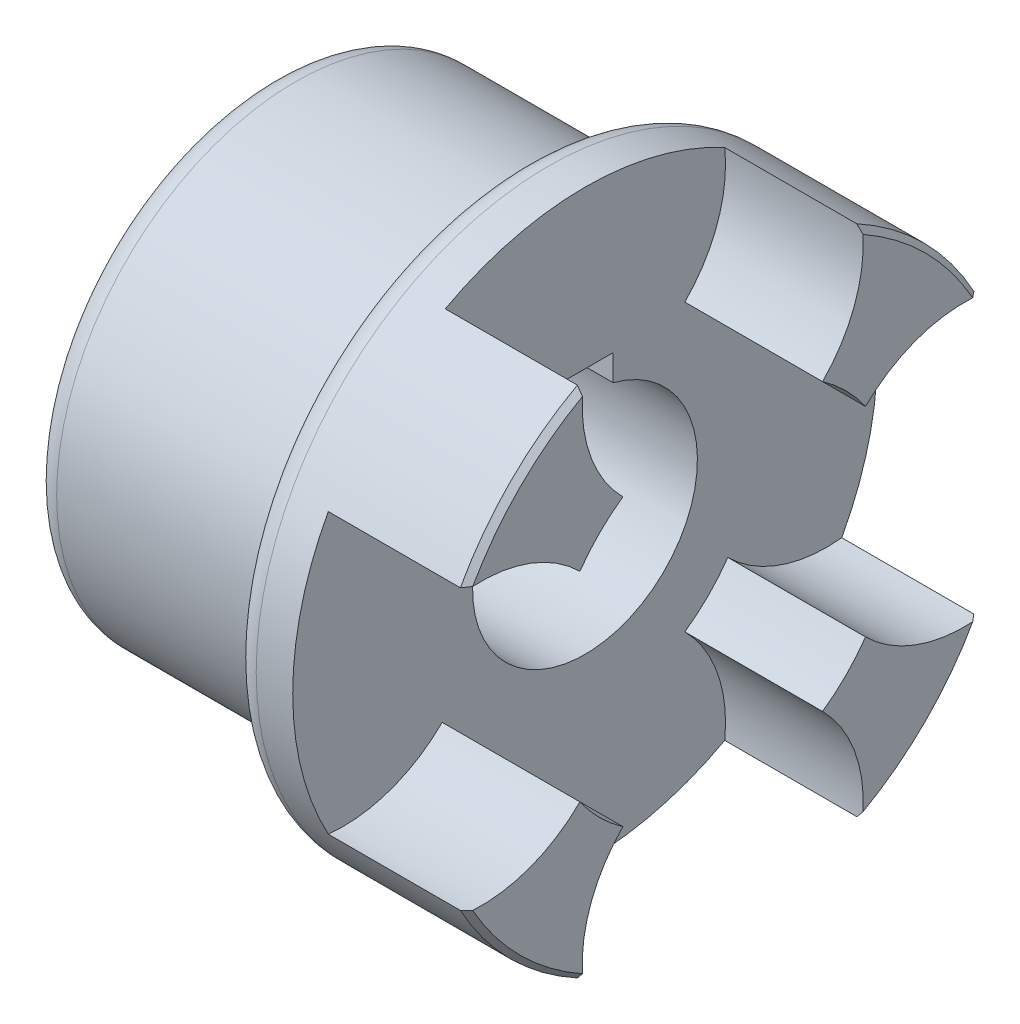
ISO-10303-21;
HEADER;
FILE_DESCRIPTION(('STEP AP214'),'2;1');
FILE_NAME('part.step','',(''),(''),'','','');
FILE_SCHEMA(('AUTOMOTIVE_DESIGN { 1 0 10303 214 1 1 1 1 }'));
ENDSEC;
DATA;
#1=APPLICATION_CONTEXT('core data for automotive mechanical design processes');
#2=APPLICATION_PROTOCOL_DEFINITION('international standard','automotive_design',2000,#1);
#3=PRODUCT_CONTEXT('',#1,'mechanical');
#4=PRODUCT('Part','Part','',(#3));
#5=PRODUCT_RELATED_PRODUCT_CATEGORY('part','',(#4));
#6=PRODUCT_DEFINITION_FORMATION('','',#4);
#7=PRODUCT_DEFINITION_CONTEXT('part definition',#1,'design');
#8=PRODUCT_DEFINITION('design','',#6,#7);
#9=PRODUCT_DEFINITION_SHAPE('','',#8);
#10=(LENGTH_UNIT() NAMED_UNIT(*) SI_UNIT(.MILLI.,.METRE.));
#11=(NAMED_UNIT(*) PLANE_ANGLE_UNIT() SI_UNIT($,.RADIAN.));
#12=(NAMED_UNIT(*) SI_UNIT($,.STERADIAN.) SOLID_ANGLE_UNIT());
#13=UNCERTAINTY_MEASURE_WITH_UNIT(LENGTH_MEASURE(1.E-05),#10,'distance_accuracy_value','');
#14=(GEOMETRIC_REPRESENTATION_CONTEXT(3) GLOBAL_UNCERTAINTY_ASSIGNED_CONTEXT((#13)) GLOBAL_UNIT_ASSIGNED_CONTEXT((#10,
#11,#12)) REPRESENTATION_CONTEXT('',''));
#15=CARTESIAN_POINT('',(0.,0.,0.));
#16=DIRECTION('',(0.,0.,1.));
#17=DIRECTION('',(1.,0.,0.));
#18=AXIS2_PLACEMENT_3D('',#15,#16,#17);
#19=CARTESIAN_POINT('',(-70.2450877192982,-27.6421929824561,0.));
#20=DIRECTION('',(-1.,0.,0.));
#21=DIRECTION('',(0.,0.,1.));
#22=AXIS2_PLACEMENT_3D('',#19,#20,#21);
#23=CYLINDRICAL_SURFACE('',#22,20.);
#24=CARTESIAN_POINT('',(-14.2450877192987,-27.6421929824561,0.));
#25=DIRECTION('',(1.,0.,0.));
#26=DIRECTION('',(0.,0.,-1.));
#27=AXIS2_PLACEMENT_3D('',#24,#25,#26);
#28=CIRCLE('',#27,20.);
#29=CARTESIAN_POINT('',(-14.2450877192987,-8.27727625141906,-5.));
#30=VERTEX_POINT('',#29);
#31=CARTESIAN_POINT('',(-14.2450877192987,-8.27727625141906,5.));
#32=VERTEX_POINT('',#31);
#33=EDGE_CURVE('E320',#30,#32,#28,.F.);
#34=ORIENTED_EDGE('',*,*,#33,.F.);
#35=DIRECTION('',(-1.,0.,0.));
#36=VECTOR('',#35,1.);
#37=CARTESIAN_POINT('',(-70.2450877192982,-8.27727625141906,-5.));
#38=LINE('',#37,#36);
#39=CARTESIAN_POINT('',(-69.2450877192982,-8.27727625141906,-5.));
#40=VERTEX_POINT('',#39);
#41=EDGE_CURVE('E264',#30,#40,#38,.T.);
#42=ORIENTED_EDGE('',*,*,#41,.T.);
#43=CARTESIAN_POINT('',(-69.2450877192982,-27.6421929824561,0.));
#44=DIRECTION('',(-1.,0.,0.));
#45=DIRECTION('',(0.,0.,1.));
#46=AXIS2_PLACEMENT_3D('',#43,#44,#45);
#47=CIRCLE('',#46,20.);
#48=CARTESIAN_POINT('',(-69.2450877192982,-8.27727625141906,5.));
#49=VERTEX_POINT('',#48);
#50=EDGE_CURVE('E550',#40,#49,#47,.T.);
#51=ORIENTED_EDGE('',*,*,#50,.T.);
#52=DIRECTION('',(-1.,0.,0.));
#53=VECTOR('',#52,1.);
#54=CARTESIAN_POINT('',(-70.2450877192982,-8.27727625141906,5.));
#55=LINE('',#54,#53);
#56=EDGE_CURVE('E239',#49,#32,#55,.F.);
#57=ORIENTED_EDGE('',*,*,#56,.T.);
#58=EDGE_LOOP('',(#34,#42,#51,#57));
#59=FACE_BOUND('',#58,.T.);
#60=ADVANCED_FACE('F35',(#59),#23,.F.);
#61=CARTESIAN_POINT('',(10.2549122807013,-6.64219298245614,0.));
#62=DIRECTION('',(-1.,0.,0.));
#63=DIRECTION('',(0.,0.,1.));
#64=AXIS2_PLACEMENT_3D('',#61,#62,#63);
#65=PLANE('',#64);
#66=CARTESIAN_POINT('',(10.2549122807009,-27.6421929824561,0.));
#67=DIRECTION('',(-1.,0.,0.));
#68=DIRECTION('',(0.,0.,1.));
#69=AXIS2_PLACEMENT_3D('',#66,#67,#68);
#70=CIRCLE('',#69,51.);
#71=CARTESIAN_POINT('',(10.2549122807013,16.8345512035899,-24.9563464194777));
#72=VERTEX_POINT('',#71);
#73=CARTESIAN_POINT('',(10.2549122807013,-2.68584656297838,-44.476744186046));
#74=VERTEX_POINT('',#73);
#75=EDGE_CURVE('E551',#72,#74,#70,.T.);
#76=ORIENTED_EDGE('',*,*,#75,.F.);
#77=CARTESIAN_POINT('',(10.2549122807013,15.3578070175439,0.));
#78=DIRECTION('',(1.,0.,0.));
#79=DIRECTION('',(0.,0.,-1.));
#80=AXIS2_PLACEMENT_3D('',#77,#78,#79);
#81=CIRCLE('',#80,25.);
#82=CARTESIAN_POINT('',(10.2549122807013,-2.23521623827009,-17.7619124173156));
#83=VERTEX_POINT('',#82);
#84=EDGE_CURVE('E272',#83,#72,#81,.T.);
#85=ORIENTED_EDGE('',*,*,#84,.F.);
#86=CARTESIAN_POINT('',(10.2549122807013,-27.6421929824561,0.));
#87=DIRECTION('',(1.,0.,0.));
#88=DIRECTION('',(0.,0.,-1.));
#89=AXIS2_PLACEMENT_3D('',#86,#87,#88);
#90=CIRCLE('',#89,31.);
#91=CARTESIAN_POINT('',(10.2549122807013,-9.88028056514053,-25.406976744186));
#92=VERTEX_POINT('',#91);
#93=EDGE_CURVE('E312',#92,#83,#90,.T.);
#94=ORIENTED_EDGE('',*,*,#93,.F.);
#95=CARTESIAN_POINT('',(10.2549122807013,-27.6421929824561,-43.));
#96=DIRECTION('',(1.,0.,0.));
#97=DIRECTION('',(0.,0.,-1.));
#98=AXIS2_PLACEMENT_3D('',#95,#96,#97);
#99=CIRCLE('',#98,25.);
#100=EDGE_CURVE('E309',#74,#92,#99,.T.);
#101=ORIENTED_EDGE('',*,*,#100,.F.);
#102=EDGE_LOOP('',(#76,#85,#94,#101));
#103=FACE_BOUND('',#102,.T.);
#104=ADVANCED_FACE('F389',(#103),#65,.F.);
#105=CARTESIAN_POINT('',(10.2549122807013,-52.5985394019339,-44.476744186046));
#106=VERTEX_POINT('',#105);
#107=CARTESIAN_POINT('',(10.2549122807013,-72.1189371685021,-24.9563464194777));
#108=VERTEX_POINT('',#107);
#109=EDGE_CURVE('E594',#106,#108,#70,.T.);
#110=ORIENTED_EDGE('',*,*,#109,.F.);
#111=CARTESIAN_POINT('',(10.2549122807013,-45.4041053997717,-25.406976744186));
#112=VERTEX_POINT('',#111);
#113=EDGE_CURVE('E310',#112,#106,#99,.T.);
#114=ORIENTED_EDGE('',*,*,#113,.F.);
#115=CARTESIAN_POINT('',(10.2549122807013,-27.6421929824561,0.));
#116=DIRECTION('',(1.,0.,0.));
#117=DIRECTION('',(0.,0.,-1.));
#118=AXIS2_PLACEMENT_3D('',#115,#116,#117);
#119=CIRCLE('',#118,31.);
#120=CARTESIAN_POINT('',(10.2549122807013,-53.0491697266422,-17.7619124173156));
#121=VERTEX_POINT('',#120);
#122=EDGE_CURVE('E306',#121,#112,#119,.T.);
#123=ORIENTED_EDGE('',*,*,#122,.F.);
#124=CARTESIAN_POINT('',(10.2549122807013,-70.6421929824561,0.));
#125=DIRECTION('',(1.,0.,0.));
#126=DIRECTION('',(0.,0.,-1.));
#127=AXIS2_PLACEMENT_3D('',#124,#125,#126);
#128=CIRCLE('',#127,25.);
#129=EDGE_CURVE('E303',#108,#121,#128,.T.);
#130=ORIENTED_EDGE('',*,*,#129,.F.);
#131=EDGE_LOOP('',(#110,#114,#123,#130));
#132=FACE_BOUND('',#131,.T.);
#133=ADVANCED_FACE('F396',(#132),#65,.F.);
#134=CARTESIAN_POINT('',(10.2549122807013,-27.6421929824561,0.));
#135=DIRECTION('',(1.,0.,0.));
#136=DIRECTION('',(0.,0.,-1.));
#137=AXIS2_PLACEMENT_3D('',#134,#135,#136);
#138=CIRCLE('',#137,31.);
#139=CARTESIAN_POINT('',(10.2549122807013,-2.23521623827007,17.7619124173156));
#140=VERTEX_POINT('',#139);
#141=CARTESIAN_POINT('',(10.2549122807013,-9.88028056514054,25.406976744186));
#142=VERTEX_POINT('',#141);
#143=EDGE_CURVE('E267',#140,#142,#138,.T.);
#144=ORIENTED_EDGE('',*,*,#143,.F.);
#145=CARTESIAN_POINT('',(10.2549122807013,16.8345512035899,24.9563464194777));
#146=VERTEX_POINT('',#145);
#147=EDGE_CURVE('E315',#146,#140,#81,.T.);
#148=ORIENTED_EDGE('',*,*,#147,.F.);
#149=CARTESIAN_POINT('',(10.2549122807013,-2.6858465629784,44.476744186046));
#150=VERTEX_POINT('',#149);
#151=EDGE_CURVE('E548',#150,#146,#70,.T.);
#152=ORIENTED_EDGE('',*,*,#151,.F.);
#153=CARTESIAN_POINT('',(10.2549122807013,-27.6421929824561,43.));
#154=DIRECTION('',(1.,0.,0.));
#155=DIRECTION('',(0.,0.,-1.));
#156=AXIS2_PLACEMENT_3D('',#153,#154,#155);
#157=CIRCLE('',#156,25.);
#158=EDGE_CURVE('E298',#142,#150,#157,.T.);
#159=ORIENTED_EDGE('',*,*,#158,.F.);
#160=EDGE_LOOP('',(#144,#148,#152,#159));
#161=FACE_BOUND('',#160,.T.);
#162=ADVANCED_FACE('F401',(#161),#65,.F.);
#163=CARTESIAN_POINT('',(10.2549122807009,-27.6421929824561,0.));
#164=DIRECTION('',(-1.,0.,0.));
#165=DIRECTION('',(0.,0.,1.));
#166=AXIS2_PLACEMENT_3D('',#163,#164,#165);
#167=CONICAL_SURFACE('',#166,51.,0.785398163397434);
#168=ORIENTED_EDGE('',*,*,#151,.T.);
#169=CARTESIAN_POINT('',(10.2551122807009,16.8343139947532,24.9563604547268));
#170=CARTESIAN_POINT('',(10.0872245951601,17.0334492690294,24.9446013152887));
#171=CARTESIAN_POINT('',(9.91991408817937,17.2328630272279,24.9304010456661));
#172=CARTESIAN_POINT('',(9.5864474214442,17.6322475233189,24.8971182450645));
#173=CARTESIAN_POINT('',(9.42029126175828,17.8322182612444,24.8780357137958));
#174=CARTESIAN_POINT('',(9.25471228070087,18.0324674831253,24.856512052053));
#175=B_SPLINE_CURVE_WITH_KNOTS('',3,(#169,#170,#171,#172,#173,#174),.UNSPECIFIED.,.F.,.F.,(4,2,
4),(0.,0.782075893543143,1.56415183349336),.UNSPECIFIED.);
#176=CARTESIAN_POINT('',(9.25491228070087,18.032225622195,24.8565380760696));
#177=VERTEX_POINT('',#176);
#178=EDGE_CURVE('E429',#146,#177,#175,.T.);
#179=ORIENTED_EDGE('',*,*,#178,.T.);
#180=CARTESIAN_POINT('',(9.25491228070087,-27.6421929824561,0.));
#181=DIRECTION('',(-1.,0.,0.));
#182=DIRECTION('',(0.,0.,1.));
#183=AXIS2_PLACEMENT_3D('',#180,#181,#182);
#184=CIRCLE('',#183,52.);
#185=CARTESIAN_POINT('',(9.25491228070087,-2.78565490638657,45.6744186046512));
#186=VERTEX_POINT('',#185);
#187=EDGE_CURVE('E542',#186,#177,#184,.T.);
#188=ORIENTED_EDGE('',*,*,#187,.F.);
#189=CARTESIAN_POINT('',(9.25471228070087,-2.78568093040313,45.6746604655814));
#190=CARTESIAN_POINT('',(9.42029126175829,-2.76415726866031,45.4744112437005));
#191=CARTESIAN_POINT('',(9.58644742144421,-2.74507473739164,45.274440505775));
#192=CARTESIAN_POINT('',(9.91991408817938,-2.71179193679007,44.875056009684));
#193=CARTESIAN_POINT('',(10.0872245951601,-2.69759166716747,44.6756422514855));
#194=CARTESIAN_POINT('',(10.2551122807009,-2.68583252772932,44.4765069772093));
#195=B_SPLINE_CURVE_WITH_KNOTS('',3,(#189,#190,#191,#192,#193,#194),.UNSPECIFIED.,.F.,.F.,(4,2,
4),(0.,0.782075939950221,1.56415183349337),.UNSPECIFIED.);
#196=EDGE_CURVE('E348',#186,#150,#195,.T.);
#197=ORIENTED_EDGE('',*,*,#196,.T.);
#198=EDGE_LOOP('',(#168,#179,#188,#197));
#199=FACE_BOUND('',#198,.T.);
#200=ADVANCED_FACE('F384',(#199),#167,.T.);
#201=CARTESIAN_POINT('',(9.25491228070087,18.032225622195,-24.8565380760696));
#202=VERTEX_POINT('',#201);
#203=CARTESIAN_POINT('',(9.25491228070087,-2.78565490638656,-45.6744186046512));
#204=VERTEX_POINT('',#203);
#205=EDGE_CURVE('E537',#202,#204,#184,.T.);
#206=ORIENTED_EDGE('',*,*,#205,.F.);
#207=CARTESIAN_POINT('',(9.25471228070087,18.0324674831253,-24.856512052053));
#208=CARTESIAN_POINT('',(9.42029126175828,17.8322182612444,-24.8780357137958));
#209=CARTESIAN_POINT('',(9.5864474214442,17.6322475233189,-24.8971182450645));
#210=CARTESIAN_POINT('',(9.91991408817938,17.2328630272279,-24.9304010456661));
#211=CARTESIAN_POINT('',(10.0872245951601,17.0334492690294,-24.9446013152887));
#212=CARTESIAN_POINT('',(10.2551122807009,16.8343139947532,-24.9563604547268));
#213=B_SPLINE_CURVE_WITH_KNOTS('',3,(#207,#208,#209,#210,#211,#212),.UNSPECIFIED.,.F.,.F.,(4,2,
4),(0.,0.782075939950219,1.56415183349336),.UNSPECIFIED.);
#214=EDGE_CURVE('E433',#202,#72,#213,.T.);
#215=ORIENTED_EDGE('',*,*,#214,.T.);
#216=ORIENTED_EDGE('',*,*,#75,.T.);
#217=CARTESIAN_POINT('',(10.2551122807009,-2.6858325277293,-44.4765069772093));
#218=CARTESIAN_POINT('',(10.0872245951601,-2.69759166716746,-44.6756422514855));
#219=CARTESIAN_POINT('',(9.91991408817938,-2.71179193679006,-44.875056009684));
#220=CARTESIAN_POINT('',(9.58644742144421,-2.74507473739163,-45.274440505775));
#221=CARTESIAN_POINT('',(9.42029126175829,-2.76415726866029,-45.4744112437005));
#222=CARTESIAN_POINT('',(9.25471228070087,-2.78568093040311,-45.6746604655814));
#223=B_SPLINE_CURVE_WITH_KNOTS('',3,(#217,#218,#219,#220,#221,#222),.UNSPECIFIED.,.F.,.F.,(4,2,
4),(0.,0.78207589354314,1.56415183349335),.UNSPECIFIED.);
#224=EDGE_CURVE('E440',#74,#204,#223,.T.);
#225=ORIENTED_EDGE('',*,*,#224,.T.);
#226=EDGE_LOOP('',(#206,#215,#216,#225));
#227=FACE_BOUND('',#226,.T.);
#228=ADVANCED_FACE('F414',(#227),#167,.T.);
#229=CARTESIAN_POINT('',(9.25491228070087,-52.4987310585257,-45.6744186046512));
#230=VERTEX_POINT('',#229);
#231=CARTESIAN_POINT('',(9.25491228070087,-73.3166115871073,-24.8565380760696));
#232=VERTEX_POINT('',#231);
#233=EDGE_CURVE('E543',#230,#232,#184,.T.);
#234=ORIENTED_EDGE('',*,*,#233,.F.);
#235=CARTESIAN_POINT('',(9.25471228070087,-52.4987050345091,-45.6746604655814));
#236=CARTESIAN_POINT('',(9.42029126175829,-52.520228696252,-45.4744112437005));
#237=CARTESIAN_POINT('',(9.58644742144421,-52.5393112275206,-45.274440505775));
#238=CARTESIAN_POINT('',(9.91991408817938,-52.5725940281222,-44.875056009684));
#239=CARTESIAN_POINT('',(10.0872245951601,-52.5867942977448,-44.6756422514855));
#240=CARTESIAN_POINT('',(10.2551122807009,-52.598553437183,-44.4765069772093));
#241=B_SPLINE_CURVE_WITH_KNOTS('',3,(#235,#236,#237,#238,#239,#240),.UNSPECIFIED.,.F.,.F.,(4,2,
4),(0.,0.782075939950222,1.56415183349337),.UNSPECIFIED.);
#242=EDGE_CURVE('E434',#230,#106,#241,.T.);
#243=ORIENTED_EDGE('',*,*,#242,.T.);
#244=ORIENTED_EDGE('',*,*,#109,.T.);
#245=CARTESIAN_POINT('',(10.2551122807009,-72.1186999596654,-24.9563604547268));
#246=CARTESIAN_POINT('',(10.0872245951601,-72.3178352339417,-24.9446013152887));
#247=CARTESIAN_POINT('',(9.91991408817937,-72.5172489921402,-24.9304010456661));
#248=CARTESIAN_POINT('',(9.5864474214442,-72.9166334882312,-24.8971182450645));
#249=CARTESIAN_POINT('',(9.42029126175828,-73.1166042261567,-24.8780357137958));
#250=CARTESIAN_POINT('',(9.25471228070086,-73.3168534480375,-24.856512052053));
#251=B_SPLINE_CURVE_WITH_KNOTS('',3,(#245,#246,#247,#248,#249,#250),.UNSPECIFIED.,.F.,.F.,(4,2,
4),(0.,0.782075893543143,1.56415183349337),.UNSPECIFIED.);
#252=EDGE_CURVE('E482',#108,#232,#251,.T.);
#253=ORIENTED_EDGE('',*,*,#252,.T.);
#254=EDGE_LOOP('',(#234,#243,#244,#253));
#255=FACE_BOUND('',#254,.T.);
#256=ADVANCED_FACE('F385',(#255),#167,.T.);
#257=CARTESIAN_POINT('',(-20.7450877192982,-27.6421929824561,0.));
#258=DIRECTION('',(-1.,0.,0.));
#259=DIRECTION('',(0.,0.,1.));
#260=AXIS2_PLACEMENT_3D('',#257,#258,#259);
#261=TOROIDAL_SURFACE('',#260,47.5,4.5);
#262=CARTESIAN_POINT('',(-25.2450877192982,-27.6421929824561,0.));
#263=DIRECTION('',(-1.,0.,0.));
#264=DIRECTION('',(0.,0.,1.));
#265=AXIS2_PLACEMENT_3D('',#262,#263,#264);
#266=CIRCLE('',#265,47.5);
#267=CARTESIAN_POINT('',(-25.2450877192982,-27.6421929824561,47.5));
#268=VERTEX_POINT('',#267);
#269=EDGE_CURVE('E522',#268,#268,#266,.T.);
#270=ORIENTED_EDGE('',*,*,#269,.F.);
#271=EDGE_LOOP('',(#270));
#272=FACE_BOUND('',#271,.T.);
#273=CARTESIAN_POINT('',(-20.7450877192982,-27.6421929824561,0.));
#274=DIRECTION('',(-1.,0.,0.));
#275=DIRECTION('',(0.,0.,1.));
#276=AXIS2_PLACEMENT_3D('',#273,#274,#275);
#277=CIRCLE('',#276,52.);
#278=CARTESIAN_POINT('',(-20.7450877192982,-27.6421929824561,52.));
#279=VERTEX_POINT('',#278);
#280=EDGE_CURVE('E437',#279,#279,#277,.T.);
#281=ORIENTED_EDGE('',*,*,#280,.T.);
#282=EDGE_LOOP('',(#281));
#283=FACE_BOUND('',#282,.T.);
#284=ADVANCED_FACE('F37',(#272,#283),#261,.T.);
#285=CARTESIAN_POINT('',(-25.2450877192982,19.3578070175439,0.));
#286=DIRECTION('',(1.,0.,0.));
#287=DIRECTION('',(0.,0.,-1.));
#288=AXIS2_PLACEMENT_3D('',#285,#286,#287);
#289=PLANE('',#288);
#290=CARTESIAN_POINT('',(-25.2450877192982,-27.6421929824561,0.));
#291=DIRECTION('',(-1.,0.,0.));
#292=DIRECTION('',(0.,0.,1.));
#293=AXIS2_PLACEMENT_3D('',#290,#291,#292);
#294=CIRCLE('',#293,47.);
#295=CARTESIAN_POINT('',(-25.2450877192982,-27.6421929824561,47.));
#296=VERTEX_POINT('',#295);
#297=EDGE_CURVE('E564',#296,#296,#294,.T.);
#298=ORIENTED_EDGE('',*,*,#297,.F.);
#299=EDGE_LOOP('',(#298));
#300=FACE_BOUND('',#299,.T.);
#301=ORIENTED_EDGE('',*,*,#269,.T.);
#302=EDGE_LOOP('',(#301));
#303=FACE_BOUND('',#302,.T.);
#304=ADVANCED_FACE('F569',(#300,#303),#289,.F.);
#305=CARTESIAN_POINT('',(-29.7450877192982,-27.6421929824561,0.));
#306=DIRECTION('',(-1.,0.,0.));
#307=DIRECTION('',(0.,0.,1.));
#308=AXIS2_PLACEMENT_3D('',#305,#306,#307);
#309=TOROIDAL_SURFACE('',#308,47.,4.5);
#310=CARTESIAN_POINT('',(-29.7450877192982,-27.6421929824561,0.));
#311=DIRECTION('',(-1.,0.,0.));
#312=DIRECTION('',(0.,0.,1.));
#313=AXIS2_PLACEMENT_3D('',#310,#311,#312);
#314=CIRCLE('',#313,42.5);
#315=CARTESIAN_POINT('',(-29.7450877192982,-27.6421929824561,42.5));
#316=VERTEX_POINT('',#315);
#317=EDGE_CURVE('E561',#316,#316,#314,.T.);
#318=ORIENTED_EDGE('',*,*,#317,.F.);
#319=EDGE_LOOP('',(#318));
#320=FACE_BOUND('',#319,.T.);
#321=ORIENTED_EDGE('',*,*,#297,.T.);
#322=EDGE_LOOP('',(#321));
#323=FACE_BOUND('',#322,.T.);
#324=ADVANCED_FACE('F655',(#320,#323),#309,.F.);
#325=CARTESIAN_POINT('',(-70.2450877192982,-27.6421929824561,0.));
#326=DIRECTION('',(-1.,0.,0.));
#327=DIRECTION('',(0.,0.,1.));
#328=AXIS2_PLACEMENT_3D('',#325,#326,#327);
#329=CYLINDRICAL_SURFACE('',#328,42.5);
#330=CARTESIAN_POINT('',(-65.7450877192982,-27.6421929824561,0.));
#331=DIRECTION('',(-1.,0.,0.));
#332=DIRECTION('',(0.,0.,1.));
#333=AXIS2_PLACEMENT_3D('',#330,#331,#332);
#334=CIRCLE('',#333,42.5);
#335=CARTESIAN_POINT('',(-65.7450877192982,-27.6421929824561,42.5));
#336=VERTEX_POINT('',#335);
#337=EDGE_CURVE('E558',#336,#336,#334,.T.);
#338=ORIENTED_EDGE('',*,*,#337,.F.);
#339=EDGE_LOOP('',(#338));
#340=FACE_BOUND('',#339,.T.);
#341=ORIENTED_EDGE('',*,*,#317,.T.);
#342=EDGE_LOOP('',(#341));
#343=FACE_BOUND('',#342,.T.);
#344=ADVANCED_FACE('F643',(#340,#343),#329,.T.);
#345=CARTESIAN_POINT('',(-65.7450877192982,-27.6421929824561,0.));
#346=DIRECTION('',(-1.,0.,0.));
#347=DIRECTION('',(0.,0.,1.));
#348=AXIS2_PLACEMENT_3D('',#345,#346,#347);
#349=TOROIDAL_SURFACE('',#348,38.,4.5);
#350=CARTESIAN_POINT('',(-70.2450877192982,-27.6421929824561,0.));
#351=DIRECTION('',(-1.,0.,0.));
#352=DIRECTION('',(0.,0.,1.));
#353=AXIS2_PLACEMENT_3D('',#350,#351,#352);
#354=CIRCLE('',#353,38.);
#355=CARTESIAN_POINT('',(-70.2450877192982,-27.6421929824561,38.));
#356=VERTEX_POINT('',#355);
#357=EDGE_CURVE('E555',#356,#356,#354,.T.);
#358=ORIENTED_EDGE('',*,*,#357,.F.);
#359=EDGE_LOOP('',(#358));
#360=FACE_BOUND('',#359,.T.);
#361=ORIENTED_EDGE('',*,*,#337,.T.);
#362=EDGE_LOOP('',(#361));
#363=FACE_BOUND('',#362,.T.);
#364=ADVANCED_FACE('F638',(#360,#363),#349,.T.);
#365=CARTESIAN_POINT('',(-70.2450877192982,10.3578070175438,0.));
#366=DIRECTION('',(1.,0.,0.));
#367=DIRECTION('',(0.,0.,-1.));
#368=AXIS2_PLACEMENT_3D('',#365,#366,#367);
#369=PLANE('',#368);
#370=CARTESIAN_POINT('',(-70.2450877192982,-27.6421929824561,0.));
#371=DIRECTION('',(-1.,0.,0.));
#372=DIRECTION('',(0.,0.,1.));
#373=AXIS2_PLACEMENT_3D('',#370,#371,#372);
#374=CIRCLE('',#373,21.);
#375=CARTESIAN_POINT('',(-70.2450877192982,-7.246114928085,-5.));
#376=VERTEX_POINT('',#375);
#377=CARTESIAN_POINT('',(-70.2450877192982,-7.246114928085,5.));
#378=VERTEX_POINT('',#377);
#379=EDGE_CURVE('E221',#376,#378,#374,.T.);
#380=ORIENTED_EDGE('',*,*,#379,.F.);
#381=DIRECTION('',(0.,1.,0.));
#382=VECTOR('',#381,1.);
#383=CARTESIAN_POINT('',(-70.2450877192982,-14.0653095975232,-5.));
#384=LINE('',#383,#382);
#385=CARTESIAN_POINT('',(-70.2450877192982,-3.64219298245611,-5.));
#386=VERTEX_POINT('',#385);
#387=EDGE_CURVE('E203',#376,#386,#384,.T.);
#388=ORIENTED_EDGE('',*,*,#387,.T.);
#389=DIRECTION('',(0.,0.,1.));
#390=VECTOR('',#389,1.);
#391=CARTESIAN_POINT('',(-70.2450877192982,-3.64219298245611,5.));
#392=LINE('',#391,#390);
#393=CARTESIAN_POINT('',(-70.2450877192982,-3.64219298245611,5.));
#394=VERTEX_POINT('',#393);
#395=EDGE_CURVE('E211',#386,#394,#392,.T.);
#396=ORIENTED_EDGE('',*,*,#395,.T.);
#397=DIRECTION('',(0.,-1.,0.));
#398=VECTOR('',#397,1.);
#399=CARTESIAN_POINT('',(-70.2450877192982,-14.0653095975232,5.));
#400=LINE('',#399,#398);
#401=EDGE_CURVE('E208',#394,#378,#400,.T.);
#402=ORIENTED_EDGE('',*,*,#401,.T.);
#403=EDGE_LOOP('',(#380,#388,#396,#402));
#404=FACE_BOUND('',#403,.T.);
#405=ORIENTED_EDGE('',*,*,#357,.T.);
#406=EDGE_LOOP('',(#405));
#407=FACE_BOUND('',#406,.T.);
#408=ADVANCED_FACE('F218',(#404,#407),#369,.F.);
#409=CARTESIAN_POINT('',(-70.2450877192982,-27.6421929824561,0.));
#410=DIRECTION('',(-1.,0.,0.));
#411=DIRECTION('',(0.,0.,1.));
#412=AXIS2_PLACEMENT_3D('',#409,#410,#411);
#413=CONICAL_SURFACE('',#412,21.,0.785398163397448);
#414=ORIENTED_EDGE('',*,*,#50,.F.);
#415=CARTESIAN_POINT('',(-60.441614299918,-17.6240989785787,-5.));
#416=CARTESIAN_POINT('',(-60.6319132635588,-17.411427010119,-5.));
#417=CARTESIAN_POINT('',(-60.8228697009393,-17.1993455629525,-5.));
#418=CARTESIAN_POINT('',(-61.205916149209,-16.7762117127348,-5.));
#419=CARTESIAN_POINT('',(-61.3980061508101,-16.565159301278,-5.));
#420=CARTESIAN_POINT('',(-61.9756969624632,-15.933325735861,-5.));
#421=CARTESIAN_POINT('',(-62.3627306311321,-15.5138548270327,-5.));
#422=CARTESIAN_POINT('',(-63.1395966118079,-14.6775770449163,-5.));
#423=CARTESIAN_POINT('',(-63.52942870842,-14.2607699711634,-5.));
#424=CARTESIAN_POINT('',(-64.3112587652203,-13.4291861803711,-5.));
#425=CARTESIAN_POINT('',(-64.7032567454464,-13.0144094821831,-5.));
#426=CARTESIAN_POINT('',(-65.4888960304184,-12.1865031610732,-5.));
#427=CARTESIAN_POINT('',(-65.8825371496714,-11.7733733620063,-5.));
#428=CARTESIAN_POINT('',(-66.6711624865166,-10.9484009023629,-5.));
#429=CARTESIAN_POINT('',(-67.0661466997256,-10.5365582375942,-5.));
#430=CARTESIAN_POINT('',(-68.2527338570508,-9.30256603409316,-5.));
#431=CARTESIAN_POINT('',(-69.0459533522821,-8.48197116757268,-5.));
#432=CARTESIAN_POINT('',(-70.6352129322475,-6.84371453145894,-5.));
#433=CARTESIAN_POINT('',(-71.4312526627803,-6.02605241779883,-5.));
#434=CARTESIAN_POINT('',(-73.025413656227,-4.39277566732919,-5.));
#435=CARTESIAN_POINT('',(-73.823534899327,-3.5771610111741,-5.));
#436=CARTESIAN_POINT('',(-75.4213834114981,-1.94736237313169,-5.));
#437=CARTESIAN_POINT('',(-76.2211108193658,-1.13317852738777,-5.));
#438=CARTESIAN_POINT('',(-77.8217582493924,0.494028123847235,-5.));
#439=CARTESIAN_POINT('',(-78.6226782804042,1.30705092063115,-5.));
#440=CARTESIAN_POINT('',(-79.4240179546315,2.11965894495444,-5.));
#441=B_SPLINE_CURVE_WITH_KNOTS('',3,(#415,#416,#417,#418,#419,#420,#421,#422,#423,#424,#425,
#426,#427,#428,#429,#430,#431,#432,#433,#434,#435,#436,#437,#438,#439,#440),.UNSPECIFIED.,.F.,
.F.,(4,2,2,2,2,2,2,2,2,2,2,2,4),(0.,0.85614305382887,1.71227910242939,3.42449708176747,
5.13658465544629,6.84868809531225,8.5606032196483,10.2725127624687,13.6964100374522,
17.1198915476229,20.5433405880735,23.9670994230612,27.3908838007139),.UNSPECIFIED.);
#442=EDGE_CURVE('E258',#40,#376,#441,.T.);
#443=ORIENTED_EDGE('',*,*,#442,.T.);
#444=ORIENTED_EDGE('',*,*,#379,.T.);
#445=CARTESIAN_POINT('',(-79.4240179546315,2.11965894495444,5.));
#446=CARTESIAN_POINT('',(-78.6226782804042,1.30705092063115,5.));
#447=CARTESIAN_POINT('',(-77.8217582493924,0.494028123847237,5.));
#448=CARTESIAN_POINT('',(-76.2211108193658,-1.13317852738776,5.));
#449=CARTESIAN_POINT('',(-75.4213834114981,-1.94736237313169,5.));
#450=CARTESIAN_POINT('',(-73.823534899327,-3.57716101117409,5.));
#451=CARTESIAN_POINT('',(-73.025413656227,-4.39277566732919,5.));
#452=CARTESIAN_POINT('',(-71.4312526627803,-6.02605241779882,5.));
#453=CARTESIAN_POINT('',(-70.6352129322475,-6.84371453145893,5.));
#454=CARTESIAN_POINT('',(-69.0459533522821,-8.48197116757267,5.));
#455=CARTESIAN_POINT('',(-68.2527338570508,-9.30256603409316,5.));
#456=CARTESIAN_POINT('',(-67.0661466997256,-10.5365582375942,5.));
#457=CARTESIAN_POINT('',(-66.6711624865166,-10.9484009023629,5.));
#458=CARTESIAN_POINT('',(-65.8825371496714,-11.7733733620063,5.));
#459=CARTESIAN_POINT('',(-65.4888960304184,-12.1865031610732,5.));
#460=CARTESIAN_POINT('',(-64.7032567454464,-13.0144094821831,5.));
#461=CARTESIAN_POINT('',(-64.3112587652203,-13.4291861803711,5.));
#462=CARTESIAN_POINT('',(-63.52942870842,-14.2607699711634,5.));
#463=CARTESIAN_POINT('',(-63.1395966118079,-14.6775770449163,5.));
#464=CARTESIAN_POINT('',(-62.3627306311321,-15.5138548270327,5.));
#465=CARTESIAN_POINT('',(-61.9756969624632,-15.933325735861,5.));
#466=CARTESIAN_POINT('',(-61.3980061508101,-16.565159301278,5.));
#467=CARTESIAN_POINT('',(-61.205916149209,-16.7762117127348,5.));
#468=CARTESIAN_POINT('',(-60.8228697009393,-17.1993455629525,5.));
#469=CARTESIAN_POINT('',(-60.6319132635588,-17.411427010119,5.));
#470=CARTESIAN_POINT('',(-60.441614299918,-17.6240989785787,5.));
#471=B_SPLINE_CURVE_WITH_KNOTS('',3,(#445,#446,#447,#448,#449,#450,#451,#452,#453,#454,#455,
#456,#457,#458,#459,#460,#461,#462,#463,#464,#465,#466,#467,#468,#469,#470),.UNSPECIFIED.,.F.,
.F.,(4,2,2,2,2,2,2,2,2,2,2,2,4),(0.,3.42378437765274,6.84754321264044,10.2709922530911,
13.6944737632617,17.1183710382452,18.8302805810656,20.5421957054017,22.2542991452676,
23.9663867189464,25.6786046982845,26.5347407468851,27.3908838007139),.UNSPECIFIED.);
#472=EDGE_CURVE('E229',#378,#49,#471,.T.);
#473=ORIENTED_EDGE('',*,*,#472,.T.);
#474=EDGE_LOOP('',(#414,#443,#444,#473));
#475=FACE_BOUND('',#474,.T.);
#476=ADVANCED_FACE('F241',(#475),#413,.F.);
#477=CARTESIAN_POINT('',(10.2549122807013,-72.1189371685021,24.9563464194777));
#478=VERTEX_POINT('',#477);
#479=CARTESIAN_POINT('',(10.2549122807013,-52.5985394019339,44.476744186046));
#480=VERTEX_POINT('',#479);
#481=EDGE_CURVE('E545',#478,#480,#70,.T.);
#482=ORIENTED_EDGE('',*,*,#481,.F.);
#483=CARTESIAN_POINT('',(10.2549122807013,-53.0491697266422,17.7619124173156));
#484=VERTEX_POINT('',#483);
#485=EDGE_CURVE('E304',#484,#478,#128,.T.);
#486=ORIENTED_EDGE('',*,*,#485,.F.);
#487=CARTESIAN_POINT('',(10.2549122807013,-27.6421929824561,0.));
#488=DIRECTION('',(1.,0.,0.));
#489=DIRECTION('',(0.,0.,-1.));
#490=AXIS2_PLACEMENT_3D('',#487,#488,#489);
#491=CIRCLE('',#490,31.);
#492=CARTESIAN_POINT('',(10.2549122807013,-45.4041053997717,25.406976744186));
#493=VERTEX_POINT('',#492);
#494=EDGE_CURVE('E300',#493,#484,#491,.T.);
#495=ORIENTED_EDGE('',*,*,#494,.F.);
#496=EDGE_CURVE('E297',#480,#493,#157,.T.);
#497=ORIENTED_EDGE('',*,*,#496,.F.);
#498=EDGE_LOOP('',(#482,#486,#495,#497));
#499=FACE_BOUND('',#498,.T.);
#500=ADVANCED_FACE('F382',(#499),#65,.F.);
#501=CARTESIAN_POINT('',(9.25491228070087,-73.3166115871073,24.8565380760696));
#502=VERTEX_POINT('',#501);
#503=CARTESIAN_POINT('',(9.25491228070087,-52.4987310585257,45.6744186046511));
#504=VERTEX_POINT('',#503);
#505=EDGE_CURVE('E546',#502,#504,#184,.T.);
#506=ORIENTED_EDGE('',*,*,#505,.F.);
#507=CARTESIAN_POINT('',(9.25471228070087,-73.3168534480375,24.856512052053));
#508=CARTESIAN_POINT('',(9.42029126175829,-73.1166042261567,24.8780357137958));
#509=CARTESIAN_POINT('',(9.58644742144421,-72.9166334882312,24.8971182450645));
#510=CARTESIAN_POINT('',(9.91991408817938,-72.5172489921402,24.9304010456661));
#511=CARTESIAN_POINT('',(10.0872245951601,-72.3178352339417,24.9446013152887));
#512=CARTESIAN_POINT('',(10.2551122807009,-72.1186999596654,24.9563604547268));
#513=B_SPLINE_CURVE_WITH_KNOTS('',3,(#507,#508,#509,#510,#511,#512),.UNSPECIFIED.,.F.,.F.,(4,2,
4),(0.,0.782075939950215,1.56415183349335),.UNSPECIFIED.);
#514=EDGE_CURVE('E476',#502,#478,#513,.T.);
#515=ORIENTED_EDGE('',*,*,#514,.T.);
#516=ORIENTED_EDGE('',*,*,#481,.T.);
#517=CARTESIAN_POINT('',(10.2551122807009,-52.5985534371829,44.4765069772093));
#518=CARTESIAN_POINT('',(10.0872245951601,-52.5867942977448,44.6756422514855));
#519=CARTESIAN_POINT('',(9.91991408817938,-52.5725940281222,44.8750560096841));
#520=CARTESIAN_POINT('',(9.58644742144421,-52.5393112275206,45.274440505775));
#521=CARTESIAN_POINT('',(9.42029126175829,-52.5202286962519,45.4744112437005));
#522=CARTESIAN_POINT('',(9.25471228070087,-52.4987050345091,45.6746604655814));
#523=B_SPLINE_CURVE_WITH_KNOTS('',3,(#517,#518,#519,#520,#521,#522),.UNSPECIFIED.,.F.,.F.,(4,2,
4),(0.,0.782075893543152,1.56415183349337),.UNSPECIFIED.);
#524=EDGE_CURVE('E339',#480,#504,#523,.T.);
#525=ORIENTED_EDGE('',*,*,#524,.T.);
#526=EDGE_LOOP('',(#506,#515,#516,#525));
#527=FACE_BOUND('',#526,.T.);
#528=ADVANCED_FACE('F354',(#527),#167,.T.);
#529=CARTESIAN_POINT('',(-70.2450877192982,-27.6421929824561,0.));
#530=DIRECTION('',(-1.,0.,0.));
#531=DIRECTION('',(0.,0.,1.));
#532=AXIS2_PLACEMENT_3D('',#529,#530,#531);
#533=CYLINDRICAL_SURFACE('',#532,52.);
#534=ORIENTED_EDGE('',*,*,#280,.F.);
#535=EDGE_LOOP('',(#534));
#536=FACE_BOUND('',#535,.T.);
#537=CARTESIAN_POINT('',(-14.2450877192987,-27.6421929824561,0.));
#538=DIRECTION('',(1.,0.,0.));
#539=DIRECTION('',(0.,0.,-1.));
#540=AXIS2_PLACEMENT_3D('',#537,#538,#539);
#541=CIRCLE('',#540,52.);
#542=CARTESIAN_POINT('',(-14.2450877192987,18.032225622195,-24.8565380760696));
#543=VERTEX_POINT('',#542);
#544=CARTESIAN_POINT('',(-14.2450877192987,18.032225622195,24.8565380760696));
#545=VERTEX_POINT('',#544);
#546=EDGE_CURVE('E523',#543,#545,#541,.T.);
#547=ORIENTED_EDGE('',*,*,#546,.F.);
#548=DIRECTION('',(1.,0.,0.));
#549=VECTOR('',#548,1.);
#550=CARTESIAN_POINT('',(-1.99508771929869,18.032225622195,-24.8565380760696));
#551=LINE('',#550,#549);
#552=EDGE_CURVE('E43',#543,#202,#551,.T.);
#553=ORIENTED_EDGE('',*,*,#552,.T.);
#554=ORIENTED_EDGE('',*,*,#205,.T.);
#555=DIRECTION('',(1.,0.,0.));
#556=VECTOR('',#555,1.);
#557=CARTESIAN_POINT('',(-1.99508771929869,-2.78565490638655,-45.6744186046511));
#558=LINE('',#557,#556);
#559=CARTESIAN_POINT('',(-14.2450877192987,-2.78565490638655,-45.6744186046511));
#560=VERTEX_POINT('',#559);
#561=EDGE_CURVE('E518',#204,#560,#558,.F.);
#562=ORIENTED_EDGE('',*,*,#561,.T.);
#563=CARTESIAN_POINT('',(-14.2450877192987,-52.4987310585257,-45.6744186046511));
#564=VERTEX_POINT('',#563);
#565=EDGE_CURVE('E515',#564,#560,#541,.T.);
#566=ORIENTED_EDGE('',*,*,#565,.F.);
#567=DIRECTION('',(1.,0.,0.));
#568=VECTOR('',#567,1.);
#569=CARTESIAN_POINT('',(-1.99508771929869,-52.4987310585257,-45.6744186046511));
#570=LINE('',#569,#568);
#571=EDGE_CURVE('E513',#564,#230,#570,.T.);
#572=ORIENTED_EDGE('',*,*,#571,.T.);
#573=ORIENTED_EDGE('',*,*,#233,.T.);
#574=DIRECTION('',(1.,0.,0.));
#575=VECTOR('',#574,1.);
#576=CARTESIAN_POINT('',(-1.99508771929869,-73.3166115871073,-24.8565380760696));
#577=LINE('',#576,#575);
#578=CARTESIAN_POINT('',(-14.2450877192987,-73.3166115871073,-24.8565380760696));
#579=VERTEX_POINT('',#578);
#580=EDGE_CURVE('E505',#232,#579,#577,.F.);
#581=ORIENTED_EDGE('',*,*,#580,.T.);
#582=CARTESIAN_POINT('',(-14.2450877192987,-73.3166115871073,24.8565380760696));
#583=VERTEX_POINT('',#582);
#584=EDGE_CURVE('E507',#583,#579,#541,.T.);
#585=ORIENTED_EDGE('',*,*,#584,.F.);
#586=DIRECTION('',(1.,0.,0.));
#587=VECTOR('',#586,1.);
#588=CARTESIAN_POINT('',(-1.99508771929869,-73.3166115871073,24.8565380760696));
#589=LINE('',#588,#587);
#590=EDGE_CURVE('E500',#583,#502,#589,.T.);
#591=ORIENTED_EDGE('',*,*,#590,.T.);
#592=ORIENTED_EDGE('',*,*,#505,.T.);
#593=DIRECTION('',(1.,0.,0.));
#594=VECTOR('',#593,1.);
#595=CARTESIAN_POINT('',(-1.99508771929869,-52.4987310585257,45.6744186046512));
#596=LINE('',#595,#594);
#597=CARTESIAN_POINT('',(-14.2450877192987,-52.4987310585257,45.6744186046512));
#598=VERTEX_POINT('',#597);
#599=EDGE_CURVE('E524',#504,#598,#596,.F.);
#600=ORIENTED_EDGE('',*,*,#599,.T.);
#601=CARTESIAN_POINT('',(-14.2450877192987,-2.78565490638657,45.6744186046512));
#602=VERTEX_POINT('',#601);
#603=EDGE_CURVE('E504',#602,#598,#541,.T.);
#604=ORIENTED_EDGE('',*,*,#603,.F.);
#605=DIRECTION('',(1.,0.,0.));
#606=VECTOR('',#605,1.);
#607=CARTESIAN_POINT('',(-1.99508771929869,-2.78565490638656,45.6744186046512));
#608=LINE('',#607,#606);
#609=EDGE_CURVE('E528',#602,#186,#608,.T.);
#610=ORIENTED_EDGE('',*,*,#609,.T.);
#611=ORIENTED_EDGE('',*,*,#187,.T.);
#612=DIRECTION('',(1.,0.,0.));
#613=VECTOR('',#612,1.);
#614=CARTESIAN_POINT('',(-1.99508771929869,18.032225622195,24.8565380760696));
#615=LINE('',#614,#613);
#616=EDGE_CURVE('E430',#177,#545,#615,.F.);
#617=ORIENTED_EDGE('',*,*,#616,.T.);
#618=EDGE_LOOP('',(#547,#553,#554,#562,#566,#572,#573,#581,#585,#591,#592,#600,#604,#610,#611,#617));
#619=FACE_BOUND('',#618,.T.);
#620=ADVANCED_FACE('F372',(#536,#619),#533,.T.);
#621=CARTESIAN_POINT('',(-14.2450877192987,15.3578070175439,0.));
#622=DIRECTION('',(1.,0.,0.));
#623=DIRECTION('',(0.,0.,-1.));
#624=AXIS2_PLACEMENT_3D('',#621,#622,#623);
#625=CYLINDRICAL_SURFACE('',#624,25.);
#626=ORIENTED_EDGE('',*,*,#552,.F.);
#627=CARTESIAN_POINT('',(-14.2450877192987,15.3578070175439,0.));
#628=DIRECTION('',(1.,0.,0.));
#629=DIRECTION('',(0.,0.,-1.));
#630=AXIS2_PLACEMENT_3D('',#627,#628,#629);
#631=CIRCLE('',#630,25.);
#632=CARTESIAN_POINT('',(-14.2450877192987,-2.23521623827009,-17.7619124173156));
#633=VERTEX_POINT('',#632);
#634=EDGE_CURVE('E291',#633,#543,#631,.T.);
#635=ORIENTED_EDGE('',*,*,#634,.F.);
#636=DIRECTION('',(1.,0.,0.));
#637=VECTOR('',#636,1.);
#638=CARTESIAN_POINT('',(-14.2450877192987,-2.23521623827009,-17.7619124173156));
#639=LINE('',#638,#637);
#640=EDGE_CURVE('E321',#633,#83,#639,.T.);
#641=ORIENTED_EDGE('',*,*,#640,.T.);
#642=ORIENTED_EDGE('',*,*,#84,.T.);
#643=ORIENTED_EDGE('',*,*,#214,.F.);
#644=EDGE_LOOP('',(#626,#635,#641,#642,#643));
#645=FACE_BOUND('',#644,.T.);
#646=ADVANCED_FACE('F374',(#645),#625,.F.);
#647=ORIENTED_EDGE('',*,*,#147,.T.);
#648=DIRECTION('',(1.,0.,0.));
#649=VECTOR('',#648,1.);
#650=CARTESIAN_POINT('',(-14.2450877192987,-2.23521623827007,17.7619124173156));
#651=LINE('',#650,#649);
#652=CARTESIAN_POINT('',(-14.2450877192987,-2.23521623827007,17.7619124173156));
#653=VERTEX_POINT('',#652);
#654=EDGE_CURVE('E317',#653,#140,#651,.T.);
#655=ORIENTED_EDGE('',*,*,#654,.F.);
#656=EDGE_CURVE('E290',#545,#653,#631,.T.);
#657=ORIENTED_EDGE('',*,*,#656,.F.);
#658=ORIENTED_EDGE('',*,*,#616,.F.);
#659=ORIENTED_EDGE('',*,*,#178,.F.);
#660=EDGE_LOOP('',(#647,#655,#657,#658,#659));
#661=FACE_BOUND('',#660,.T.);
#662=ADVANCED_FACE('F380',(#661),#625,.F.);
#663=CARTESIAN_POINT('',(-14.2450877192987,-27.6421929824561,-43.));
#664=DIRECTION('',(1.,0.,0.));
#665=DIRECTION('',(0.,0.,-1.));
#666=AXIS2_PLACEMENT_3D('',#663,#664,#665);
#667=CYLINDRICAL_SURFACE('',#666,25.);
#668=ORIENTED_EDGE('',*,*,#571,.F.);
#669=CARTESIAN_POINT('',(-14.2450877192987,-27.6421929824561,-43.));
#670=DIRECTION('',(1.,0.,0.));
#671=DIRECTION('',(0.,0.,-1.));
#672=AXIS2_PLACEMENT_3D('',#669,#670,#671);
#673=CIRCLE('',#672,25.);
#674=CARTESIAN_POINT('',(-14.2450877192987,-45.4041053997717,-25.406976744186));
#675=VERTEX_POINT('',#674);
#676=EDGE_CURVE('E57',#675,#564,#673,.T.);
#677=ORIENTED_EDGE('',*,*,#676,.F.);
#678=DIRECTION('',(1.,0.,0.));
#679=VECTOR('',#678,1.);
#680=CARTESIAN_POINT('',(-14.2450877192987,-45.4041053997717,-25.406976744186));
#681=LINE('',#680,#679);
#682=EDGE_CURVE('E326',#675,#112,#681,.T.);
#683=ORIENTED_EDGE('',*,*,#682,.T.);
#684=ORIENTED_EDGE('',*,*,#113,.T.);
#685=ORIENTED_EDGE('',*,*,#242,.F.);
#686=EDGE_LOOP('',(#668,#677,#683,#684,#685));
#687=FACE_BOUND('',#686,.T.);
#688=ADVANCED_FACE('F463',(#687),#667,.F.);
#689=ORIENTED_EDGE('',*,*,#100,.T.);
#690=DIRECTION('',(1.,0.,0.));
#691=VECTOR('',#690,1.);
#692=CARTESIAN_POINT('',(-14.2450877192987,-9.88028056514053,-25.406976744186));
#693=LINE('',#692,#691);
#694=CARTESIAN_POINT('',(-14.2450877192987,-9.88028056514053,-25.406976744186));
#695=VERTEX_POINT('',#694);
#696=EDGE_CURVE('E323',#695,#92,#693,.T.);
#697=ORIENTED_EDGE('',*,*,#696,.F.);
#698=EDGE_CURVE('E285',#560,#695,#673,.T.);
#699=ORIENTED_EDGE('',*,*,#698,.F.);
#700=ORIENTED_EDGE('',*,*,#561,.F.);
#701=ORIENTED_EDGE('',*,*,#224,.F.);
#702=EDGE_LOOP('',(#689,#697,#699,#700,#701));
#703=FACE_BOUND('',#702,.T.);
#704=ADVANCED_FACE('F467',(#703),#667,.F.);
#705=CARTESIAN_POINT('',(-14.2450877192987,-70.6421929824561,0.));
#706=DIRECTION('',(1.,0.,0.));
#707=DIRECTION('',(0.,0.,-1.));
#708=AXIS2_PLACEMENT_3D('',#705,#706,#707);
#709=CYLINDRICAL_SURFACE('',#708,25.);
#710=ORIENTED_EDGE('',*,*,#590,.F.);
#711=CARTESIAN_POINT('',(-14.2450877192987,-70.6421929824561,0.));
#712=DIRECTION('',(1.,0.,0.));
#713=DIRECTION('',(0.,0.,-1.));
#714=AXIS2_PLACEMENT_3D('',#711,#712,#713);
#715=CIRCLE('',#714,25.);
#716=CARTESIAN_POINT('',(-14.2450877192987,-53.0491697266422,17.7619124173156));
#717=VERTEX_POINT('',#716);
#718=EDGE_CURVE('E280',#717,#583,#715,.T.);
#719=ORIENTED_EDGE('',*,*,#718,.F.);
#720=DIRECTION('',(1.,0.,0.));
#721=VECTOR('',#720,1.);
#722=CARTESIAN_POINT('',(-14.2450877192987,-53.0491697266422,17.7619124173156));
#723=LINE('',#722,#721);
#724=EDGE_CURVE('E331',#717,#484,#723,.T.);
#725=ORIENTED_EDGE('',*,*,#724,.T.);
#726=ORIENTED_EDGE('',*,*,#485,.T.);
#727=ORIENTED_EDGE('',*,*,#514,.F.);
#728=EDGE_LOOP('',(#710,#719,#725,#726,#727));
#729=FACE_BOUND('',#728,.T.);
#730=ADVANCED_FACE('F487',(#729),#709,.F.);
#731=ORIENTED_EDGE('',*,*,#129,.T.);
#732=DIRECTION('',(1.,0.,0.));
#733=VECTOR('',#732,1.);
#734=CARTESIAN_POINT('',(-14.2450877192987,-53.0491697266422,-17.7619124173156));
#735=LINE('',#734,#733);
#736=CARTESIAN_POINT('',(-14.2450877192987,-53.0491697266422,-17.7619124173156));
#737=VERTEX_POINT('',#736);
#738=EDGE_CURVE('E328',#737,#121,#735,.T.);
#739=ORIENTED_EDGE('',*,*,#738,.F.);
#740=EDGE_CURVE('E279',#579,#737,#715,.T.);
#741=ORIENTED_EDGE('',*,*,#740,.F.);
#742=ORIENTED_EDGE('',*,*,#580,.F.);
#743=ORIENTED_EDGE('',*,*,#252,.F.);
#744=EDGE_LOOP('',(#731,#739,#741,#742,#743));
#745=FACE_BOUND('',#744,.T.);
#746=ADVANCED_FACE('F364',(#745),#709,.F.);
#747=CARTESIAN_POINT('',(-14.2450877192987,-27.6421929824561,43.));
#748=DIRECTION('',(1.,0.,0.));
#749=DIRECTION('',(0.,0.,-1.));
#750=AXIS2_PLACEMENT_3D('',#747,#748,#749);
#751=CYLINDRICAL_SURFACE('',#750,25.);
#752=ORIENTED_EDGE('',*,*,#609,.F.);
#753=CARTESIAN_POINT('',(-14.2450877192987,-27.6421929824561,43.));
#754=DIRECTION('',(1.,0.,0.));
#755=DIRECTION('',(0.,0.,-1.));
#756=AXIS2_PLACEMENT_3D('',#753,#754,#755);
#757=CIRCLE('',#756,25.);
#758=CARTESIAN_POINT('',(-14.2450877192987,-9.88028056514054,25.406976744186));
#759=VERTEX_POINT('',#758);
#760=EDGE_CURVE('E273',#759,#602,#757,.T.);
#761=ORIENTED_EDGE('',*,*,#760,.F.);
#762=DIRECTION('',(1.,0.,0.));
#763=VECTOR('',#762,1.);
#764=CARTESIAN_POINT('',(-14.2450877192987,-9.88028056514054,25.406976744186));
#765=LINE('',#764,#763);
#766=EDGE_CURVE('E294',#759,#142,#765,.T.);
#767=ORIENTED_EDGE('',*,*,#766,.T.);
#768=ORIENTED_EDGE('',*,*,#158,.T.);
#769=ORIENTED_EDGE('',*,*,#196,.F.);
#770=EDGE_LOOP('',(#752,#761,#767,#768,#769));
#771=FACE_BOUND('',#770,.T.);
#772=ADVANCED_FACE('F358',(#771),#751,.F.);
#773=ORIENTED_EDGE('',*,*,#496,.T.);
#774=DIRECTION('',(1.,0.,0.));
#775=VECTOR('',#774,1.);
#776=CARTESIAN_POINT('',(-14.2450877192987,-45.4041053997717,25.406976744186));
#777=LINE('',#776,#775);
#778=CARTESIAN_POINT('',(-14.2450877192987,-45.4041053997717,25.406976744186));
#779=VERTEX_POINT('',#778);
#780=EDGE_CURVE('E333',#779,#493,#777,.T.);
#781=ORIENTED_EDGE('',*,*,#780,.F.);
#782=EDGE_CURVE('E271',#598,#779,#757,.T.);
#783=ORIENTED_EDGE('',*,*,#782,.F.);
#784=ORIENTED_EDGE('',*,*,#599,.F.);
#785=ORIENTED_EDGE('',*,*,#524,.F.);
#786=EDGE_LOOP('',(#773,#781,#783,#784,#785));
#787=FACE_BOUND('',#786,.T.);
#788=ADVANCED_FACE('F363',(#787),#751,.F.);
#789=CARTESIAN_POINT('',(-14.2450877192987,-27.6421929824561,21.5));
#790=DIRECTION('',(1.,0.,0.));
#791=DIRECTION('',(0.,0.,-1.));
#792=AXIS2_PLACEMENT_3D('',#789,#790,#791);
#793=PLANE('',#792);
#794=DIRECTION('',(0.,1.,0.));
#795=VECTOR('',#794,1.);
#796=CARTESIAN_POINT('',(-14.2450877192987,-27.6421929824561,-5.));
#797=LINE('',#796,#795);
#798=CARTESIAN_POINT('',(-14.2450877192987,-3.64219298245611,-5.));
#799=VERTEX_POINT('',#798);
#800=EDGE_CURVE('E11',#30,#799,#797,.T.);
#801=ORIENTED_EDGE('',*,*,#800,.F.);
#802=ORIENTED_EDGE('',*,*,#33,.T.);
#803=DIRECTION('',(0.,-1.,0.));
#804=VECTOR('',#803,1.);
#805=CARTESIAN_POINT('',(-14.2450877192987,-14.0653095975232,5.));
#806=LINE('',#805,#804);
#807=CARTESIAN_POINT('',(-14.2450877192987,-3.64219298245611,5.));
#808=VERTEX_POINT('',#807);
#809=EDGE_CURVE('E222',#808,#32,#806,.T.);
#810=ORIENTED_EDGE('',*,*,#809,.F.);
#811=DIRECTION('',(0.,0.,1.));
#812=VECTOR('',#811,1.);
#813=CARTESIAN_POINT('',(-14.2450877192987,-3.64219298245611,5.));
#814=LINE('',#813,#812);
#815=EDGE_CURVE('E224',#799,#808,#814,.T.);
#816=ORIENTED_EDGE('',*,*,#815,.F.);
#817=EDGE_LOOP('',(#801,#802,#810,#816));
#818=FACE_BOUND('',#817,.T.);
#819=ORIENTED_EDGE('',*,*,#546,.T.);
#820=ORIENTED_EDGE('',*,*,#656,.T.);
#821=CARTESIAN_POINT('',(-14.2450877192987,-27.6421929824561,0.));
#822=DIRECTION('',(1.,0.,0.));
#823=DIRECTION('',(0.,0.,-1.));
#824=AXIS2_PLACEMENT_3D('',#821,#822,#823);
#825=CIRCLE('',#824,31.);
#826=EDGE_CURVE('E268',#653,#759,#825,.T.);
#827=ORIENTED_EDGE('',*,*,#826,.T.);
#828=ORIENTED_EDGE('',*,*,#760,.T.);
#829=ORIENTED_EDGE('',*,*,#603,.T.);
#830=ORIENTED_EDGE('',*,*,#782,.T.);
#831=CARTESIAN_POINT('',(-14.2450877192987,-27.6421929824561,0.));
#832=DIRECTION('',(1.,0.,0.));
#833=DIRECTION('',(0.,0.,-1.));
#834=AXIS2_PLACEMENT_3D('',#831,#832,#833);
#835=CIRCLE('',#834,31.);
#836=EDGE_CURVE('E276',#779,#717,#835,.T.);
#837=ORIENTED_EDGE('',*,*,#836,.T.);
#838=ORIENTED_EDGE('',*,*,#718,.T.);
#839=ORIENTED_EDGE('',*,*,#584,.T.);
#840=ORIENTED_EDGE('',*,*,#740,.T.);
#841=CARTESIAN_POINT('',(-14.2450877192987,-27.6421929824561,0.));
#842=DIRECTION('',(1.,0.,0.));
#843=DIRECTION('',(0.,0.,-1.));
#844=AXIS2_PLACEMENT_3D('',#841,#842,#843);
#845=CIRCLE('',#844,31.);
#846=EDGE_CURVE('E283',#737,#675,#845,.T.);
#847=ORIENTED_EDGE('',*,*,#846,.T.);
#848=ORIENTED_EDGE('',*,*,#676,.T.);
#849=ORIENTED_EDGE('',*,*,#565,.T.);
#850=ORIENTED_EDGE('',*,*,#698,.T.);
#851=CARTESIAN_POINT('',(-14.2450877192987,-27.6421929824561,0.));
#852=DIRECTION('',(1.,0.,0.));
#853=DIRECTION('',(0.,0.,-1.));
#854=AXIS2_PLACEMENT_3D('',#851,#852,#853);
#855=CIRCLE('',#854,31.);
#856=EDGE_CURVE('E287',#695,#633,#855,.T.);
#857=ORIENTED_EDGE('',*,*,#856,.T.);
#858=ORIENTED_EDGE('',*,*,#634,.T.);
#859=EDGE_LOOP('',(#819,#820,#827,#828,#829,#830,#837,#838,#839,#840,#847,#848,#849,#850,#857,#858));
#860=FACE_BOUND('',#859,.T.);
#861=ADVANCED_FACE('F256',(#818,#860),#793,.T.);
#862=CARTESIAN_POINT('',(-14.2450877192987,-27.6421929824561,0.));
#863=DIRECTION('',(1.,0.,0.));
#864=DIRECTION('',(0.,0.,-1.));
#865=AXIS2_PLACEMENT_3D('',#862,#863,#864);
#866=CYLINDRICAL_SURFACE('',#865,31.);
#867=ORIENTED_EDGE('',*,*,#143,.T.);
#868=ORIENTED_EDGE('',*,*,#766,.F.);
#869=ORIENTED_EDGE('',*,*,#826,.F.);
#870=ORIENTED_EDGE('',*,*,#654,.T.);
#871=EDGE_LOOP('',(#867,#868,#869,#870));
#872=FACE_BOUND('',#871,.T.);
#873=ADVANCED_FACE('F367',(#872),#866,.F.);
#874=CARTESIAN_POINT('',(-14.2450877192987,-27.6421929824561,0.));
#875=DIRECTION('',(1.,0.,0.));
#876=DIRECTION('',(0.,0.,-1.));
#877=AXIS2_PLACEMENT_3D('',#874,#875,#876);
#878=CYLINDRICAL_SURFACE('',#877,31.);
#879=ORIENTED_EDGE('',*,*,#93,.T.);
#880=ORIENTED_EDGE('',*,*,#640,.F.);
#881=ORIENTED_EDGE('',*,*,#856,.F.);
#882=ORIENTED_EDGE('',*,*,#696,.T.);
#883=EDGE_LOOP('',(#879,#880,#881,#882));
#884=FACE_BOUND('',#883,.T.);
#885=ADVANCED_FACE('F370',(#884),#878,.F.);
#886=CARTESIAN_POINT('',(-14.2450877192987,-27.6421929824561,0.));
#887=DIRECTION('',(1.,0.,0.));
#888=DIRECTION('',(0.,0.,-1.));
#889=AXIS2_PLACEMENT_3D('',#886,#887,#888);
#890=CYLINDRICAL_SURFACE('',#889,31.);
#891=ORIENTED_EDGE('',*,*,#122,.T.);
#892=ORIENTED_EDGE('',*,*,#682,.F.);
#893=ORIENTED_EDGE('',*,*,#846,.F.);
#894=ORIENTED_EDGE('',*,*,#738,.T.);
#895=EDGE_LOOP('',(#891,#892,#893,#894));
#896=FACE_BOUND('',#895,.T.);
#897=ADVANCED_FACE('F461',(#896),#890,.F.);
#898=CARTESIAN_POINT('',(-14.2450877192987,-27.6421929824561,0.));
#899=DIRECTION('',(1.,0.,0.));
#900=DIRECTION('',(0.,0.,-1.));
#901=AXIS2_PLACEMENT_3D('',#898,#899,#900);
#902=CYLINDRICAL_SURFACE('',#901,31.);
#903=ORIENTED_EDGE('',*,*,#494,.T.);
#904=ORIENTED_EDGE('',*,*,#724,.F.);
#905=ORIENTED_EDGE('',*,*,#836,.F.);
#906=ORIENTED_EDGE('',*,*,#780,.T.);
#907=EDGE_LOOP('',(#903,#904,#905,#906));
#908=FACE_BOUND('',#907,.T.);
#909=ADVANCED_FACE('F255',(#908),#902,.F.);
#910=CARTESIAN_POINT('',(-70.2450877192982,-14.0653095975232,-5.));
#911=DIRECTION('',(0.,0.,-1.));
#912=DIRECTION('',(-1.,0.,0.));
#913=AXIS2_PLACEMENT_3D('',#910,#911,#912);
#914=PLANE('',#913);
#915=ORIENTED_EDGE('',*,*,#800,.T.);
#916=DIRECTION('',(1.,0.,0.));
#917=VECTOR('',#916,1.);
#918=CARTESIAN_POINT('',(-70.2450877192982,-3.64219298245611,-5.));
#919=LINE('',#918,#917);
#920=EDGE_CURVE('E50',#386,#799,#919,.T.);
#921=ORIENTED_EDGE('',*,*,#920,.F.);
#922=ORIENTED_EDGE('',*,*,#387,.F.);
#923=ORIENTED_EDGE('',*,*,#442,.F.);
#924=ORIENTED_EDGE('',*,*,#41,.F.);
#925=EDGE_LOOP('',(#915,#921,#922,#923,#924));
#926=FACE_BOUND('',#925,.T.);
#927=ADVANCED_FACE('F201',(#926),#914,.F.);
#928=CARTESIAN_POINT('',(-70.2450877192982,-14.0653095975232,5.));
#929=DIRECTION('',(0.,0.,1.));
#930=DIRECTION('',(1.,0.,0.));
#931=AXIS2_PLACEMENT_3D('',#928,#929,#930);
#932=PLANE('',#931);
#933=ORIENTED_EDGE('',*,*,#472,.F.);
#934=ORIENTED_EDGE('',*,*,#401,.F.);
#935=DIRECTION('',(1.,0.,0.));
#936=VECTOR('',#935,1.);
#937=CARTESIAN_POINT('',(-70.2450877192982,-3.64219298245611,5.));
#938=LINE('',#937,#936);
#939=EDGE_CURVE('E207',#394,#808,#938,.T.);
#940=ORIENTED_EDGE('',*,*,#939,.T.);
#941=ORIENTED_EDGE('',*,*,#809,.T.);
#942=ORIENTED_EDGE('',*,*,#56,.F.);
#943=EDGE_LOOP('',(#933,#934,#940,#941,#942));
#944=FACE_BOUND('',#943,.T.);
#945=ADVANCED_FACE('F245',(#944),#932,.F.);
#946=CARTESIAN_POINT('',(-70.2450877192982,-3.64219298245611,5.));
#947=DIRECTION('',(0.,1.,0.));
#948=DIRECTION('',(0.,0.,1.));
#949=AXIS2_PLACEMENT_3D('',#946,#947,#948);
#950=PLANE('',#949);
#951=ORIENTED_EDGE('',*,*,#815,.T.);
#952=ORIENTED_EDGE('',*,*,#939,.F.);
#953=ORIENTED_EDGE('',*,*,#395,.F.);
#954=ORIENTED_EDGE('',*,*,#920,.T.);
#955=EDGE_LOOP('',(#951,#952,#953,#954));
#956=FACE_BOUND('',#955,.T.);
#957=ADVANCED_FACE('F212',(#956),#950,.F.);
#958=CLOSED_SHELL('',(#60,#104,#133,#162,#200,#228,#256,#284,#304,#324,#344,#364,#408,#476,#500,
#528,#620,#646,#662,#688,#704,#730,#746,#772,#788,#861,#873,#885,#897,#909,#927,#945,#957));
#959=MANIFOLD_SOLID_BREP('B2',#958);
#960=ADVANCED_BREP_SHAPE_REPRESENTATION('',(#18,#959),#14);
#961=SHAPE_DEFINITION_REPRESENTATION(#9,#960);
ENDSEC;
END-ISO-10303-21;
